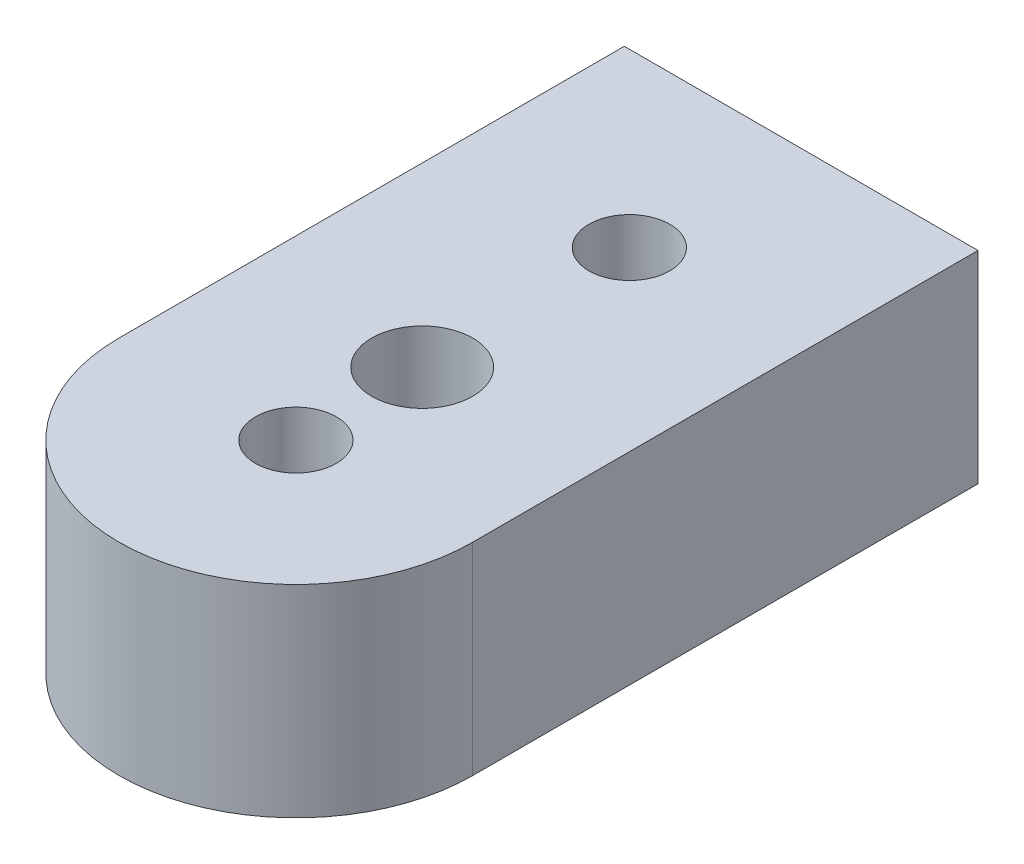
ISO-10303-21;
HEADER;
FILE_DESCRIPTION(('STEP AP214'),'2;1');
FILE_NAME('part.step','',(''),(''),'','','');
FILE_SCHEMA(('AUTOMOTIVE_DESIGN { 1 0 10303 214 1 1 1 1 }'));
ENDSEC;
DATA;
#1=APPLICATION_CONTEXT('core data for automotive mechanical design processes');
#2=APPLICATION_PROTOCOL_DEFINITION('international standard','automotive_design',2000,#1);
#3=PRODUCT_CONTEXT('',#1,'mechanical');
#4=PRODUCT('Part','Part','',(#3));
#5=PRODUCT_RELATED_PRODUCT_CATEGORY('part','',(#4));
#6=PRODUCT_DEFINITION_FORMATION('','',#4);
#7=PRODUCT_DEFINITION_CONTEXT('part definition',#1,'design');
#8=PRODUCT_DEFINITION('design','',#6,#7);
#9=PRODUCT_DEFINITION_SHAPE('','',#8);
#10=(LENGTH_UNIT() NAMED_UNIT(*) SI_UNIT(.MILLI.,.METRE.));
#11=(NAMED_UNIT(*) PLANE_ANGLE_UNIT() SI_UNIT($,.RADIAN.));
#12=(NAMED_UNIT(*) SI_UNIT($,.STERADIAN.) SOLID_ANGLE_UNIT());
#13=UNCERTAINTY_MEASURE_WITH_UNIT(LENGTH_MEASURE(1.E-05),#10,'distance_accuracy_value','');
#14=(GEOMETRIC_REPRESENTATION_CONTEXT(3) GLOBAL_UNCERTAINTY_ASSIGNED_CONTEXT((#13)) GLOBAL_UNIT_ASSIGNED_CONTEXT((#10,
#11,#12)) REPRESENTATION_CONTEXT('',''));
#15=CARTESIAN_POINT('',(0.,0.,0.));
#16=DIRECTION('',(0.,0.,1.));
#17=DIRECTION('',(1.,0.,0.));
#18=AXIS2_PLACEMENT_3D('',#15,#16,#17);
#19=CARTESIAN_POINT('',(0.,8.,5.));
#20=DIRECTION('',(0.,-1.,0.));
#21=DIRECTION('',(0.,0.,-1.));
#22=AXIS2_PLACEMENT_3D('',#19,#20,#21);
#23=PLANE('',#22);
#24=DIRECTION('',(0.,0.,1.));
#25=VECTOR('',#24,1.);
#26=CARTESIAN_POINT('',(-6.99999999999996,8.,5.));
#27=LINE('',#26,#25);
#28=CARTESIAN_POINT('',(-6.99999999999996,8.,-15.));
#29=VERTEX_POINT('',#28);
#30=CARTESIAN_POINT('',(-6.99999999999996,8.,5.));
#31=VERTEX_POINT('',#30);
#32=EDGE_CURVE('E88',#29,#31,#27,.T.);
#33=ORIENTED_EDGE('',*,*,#32,.T.);
#34=CARTESIAN_POINT('',(0.,8.,5.));
#35=DIRECTION('',(0.,1.,0.));
#36=DIRECTION('',(0.,0.,-1.));
#37=AXIS2_PLACEMENT_3D('',#34,#35,#36);
#38=CIRCLE('',#37,7.);
#39=CARTESIAN_POINT('',(7.00000000000004,8.,5.));
#40=VERTEX_POINT('',#39);
#41=EDGE_CURVE('E83',#31,#40,#38,.T.);
#42=ORIENTED_EDGE('',*,*,#41,.T.);
#43=DIRECTION('',(0.,0.,-1.));
#44=VECTOR('',#43,1.);
#45=CARTESIAN_POINT('',(7.00000000000004,8.,-15.));
#46=LINE('',#45,#44);
#47=CARTESIAN_POINT('',(7.00000000000004,8.,-15.));
#48=VERTEX_POINT('',#47);
#49=EDGE_CURVE('E86',#40,#48,#46,.T.);
#50=ORIENTED_EDGE('',*,*,#49,.T.);
#51=DIRECTION('',(-1.,0.,0.));
#52=VECTOR('',#51,1.);
#53=CARTESIAN_POINT('',(-6.99999999999996,8.,-15.));
#54=LINE('',#53,#52);
#55=EDGE_CURVE('E53',#48,#29,#54,.T.);
#56=ORIENTED_EDGE('',*,*,#55,.T.);
#57=EDGE_LOOP('',(#33,#42,#50,#56));
#58=FACE_BOUND('',#57,.T.);
#59=CARTESIAN_POINT('',(0.,8.,0.));
#60=DIRECTION('',(0.,1.,0.));
#61=DIRECTION('',(0.,0.,1.));
#62=AXIS2_PLACEMENT_3D('',#59,#60,#61);
#63=CIRCLE('',#62,2.);
#64=CARTESIAN_POINT('',(0.,8.,2.));
#65=VERTEX_POINT('',#64);
#66=EDGE_CURVE('E103',#65,#65,#63,.T.);
#67=ORIENTED_EDGE('',*,*,#66,.F.);
#68=EDGE_LOOP('',(#67));
#69=FACE_BOUND('',#68,.T.);
#70=CARTESIAN_POINT('',(0.,8.,5.));
#71=DIRECTION('',(0.,1.,0.));
#72=DIRECTION('',(0.,0.,1.));
#73=AXIS2_PLACEMENT_3D('',#70,#71,#72);
#74=CIRCLE('',#73,1.60000000000002);
#75=CARTESIAN_POINT('',(0.,8.,6.60000000000002));
#76=VERTEX_POINT('',#75);
#77=EDGE_CURVE('E118',#76,#76,#74,.T.);
#78=ORIENTED_EDGE('',*,*,#77,.F.);
#79=EDGE_LOOP('',(#78));
#80=FACE_BOUND('',#79,.T.);
#81=CARTESIAN_POINT('',(0.,8.,-8.2));
#82=DIRECTION('',(0.,1.,0.));
#83=DIRECTION('',(0.,0.,1.));
#84=AXIS2_PLACEMENT_3D('',#81,#82,#83);
#85=CIRCLE('',#84,1.6);
#86=CARTESIAN_POINT('',(0.,8.,-6.6));
#87=VERTEX_POINT('',#86);
#88=EDGE_CURVE('E124',#87,#87,#85,.T.);
#89=ORIENTED_EDGE('',*,*,#88,.F.);
#90=EDGE_LOOP('',(#89));
#91=FACE_BOUND('',#90,.T.);
#92=ADVANCED_FACE('F36',(#58,#69,#80,#91),#23,.F.);
#93=CARTESIAN_POINT('',(0.,0.,5.));
#94=DIRECTION('',(0.,-1.,0.));
#95=DIRECTION('',(0.,0.,-1.));
#96=AXIS2_PLACEMENT_3D('',#93,#94,#95);
#97=PLANE('',#96);
#98=CARTESIAN_POINT('',(0.,0.,5.));
#99=DIRECTION('',(0.,1.,0.));
#100=DIRECTION('',(0.,0.,1.));
#101=AXIS2_PLACEMENT_3D('',#98,#99,#100);
#102=CIRCLE('',#101,1.60000000000002);
#103=CARTESIAN_POINT('',(0.,0.,6.60000000000002));
#104=VERTEX_POINT('',#103);
#105=EDGE_CURVE('E121',#104,#104,#102,.T.);
#106=ORIENTED_EDGE('',*,*,#105,.T.);
#107=EDGE_LOOP('',(#106));
#108=FACE_BOUND('',#107,.T.);
#109=DIRECTION('',(0.,0.,1.));
#110=VECTOR('',#109,1.);
#111=CARTESIAN_POINT('',(-6.99999999999996,0.,5.));
#112=LINE('',#111,#110);
#113=CARTESIAN_POINT('',(-6.99999999999996,0.,-15.));
#114=VERTEX_POINT('',#113);
#115=CARTESIAN_POINT('',(-6.99999999999996,0.,5.));
#116=VERTEX_POINT('',#115);
#117=EDGE_CURVE('E100',#114,#116,#112,.T.);
#118=ORIENTED_EDGE('',*,*,#117,.F.);
#119=DIRECTION('',(-1.,0.,0.));
#120=VECTOR('',#119,1.);
#121=CARTESIAN_POINT('',(-6.99999999999996,0.,-15.));
#122=LINE('',#121,#120);
#123=CARTESIAN_POINT('',(7.00000000000004,0.,-15.));
#124=VERTEX_POINT('',#123);
#125=EDGE_CURVE('E76',#124,#114,#122,.T.);
#126=ORIENTED_EDGE('',*,*,#125,.F.);
#127=DIRECTION('',(0.,0.,-1.));
#128=VECTOR('',#127,1.);
#129=CARTESIAN_POINT('',(7.00000000000004,0.,-15.));
#130=LINE('',#129,#128);
#131=CARTESIAN_POINT('',(7.00000000000004,0.,5.));
#132=VERTEX_POINT('',#131);
#133=EDGE_CURVE('E70',#132,#124,#130,.T.);
#134=ORIENTED_EDGE('',*,*,#133,.F.);
#135=CARTESIAN_POINT('',(0.,0.,5.));
#136=DIRECTION('',(0.,1.,0.));
#137=DIRECTION('',(0.,0.,-1.));
#138=AXIS2_PLACEMENT_3D('',#135,#136,#137);
#139=CIRCLE('',#138,7.);
#140=EDGE_CURVE('E92',#116,#132,#139,.T.);
#141=ORIENTED_EDGE('',*,*,#140,.F.);
#142=EDGE_LOOP('',(#118,#126,#134,#141));
#143=FACE_BOUND('',#142,.T.);
#144=CARTESIAN_POINT('',(0.,0.,0.));
#145=DIRECTION('',(0.,1.,0.));
#146=DIRECTION('',(0.,0.,1.));
#147=AXIS2_PLACEMENT_3D('',#144,#145,#146);
#148=CIRCLE('',#147,2.);
#149=CARTESIAN_POINT('',(0.,0.,2.));
#150=VERTEX_POINT('',#149);
#151=EDGE_CURVE('E115',#150,#150,#148,.T.);
#152=ORIENTED_EDGE('',*,*,#151,.T.);
#153=EDGE_LOOP('',(#152));
#154=FACE_BOUND('',#153,.T.);
#155=CARTESIAN_POINT('',(0.,0.,-8.2));
#156=DIRECTION('',(0.,1.,0.));
#157=DIRECTION('',(0.,0.,1.));
#158=AXIS2_PLACEMENT_3D('',#155,#156,#157);
#159=CIRCLE('',#158,1.6);
#160=CARTESIAN_POINT('',(0.,0.,-6.6));
#161=VERTEX_POINT('',#160);
#162=EDGE_CURVE('E127',#161,#161,#159,.T.);
#163=ORIENTED_EDGE('',*,*,#162,.T.);
#164=EDGE_LOOP('',(#163));
#165=FACE_BOUND('',#164,.T.);
#166=ADVANCED_FACE('F111',(#108,#143,#154,#165),#97,.T.);
#167=CARTESIAN_POINT('',(-6.99999999999996,8.,5.));
#168=DIRECTION('',(1.,0.,0.));
#169=DIRECTION('',(0.,0.,-1.));
#170=AXIS2_PLACEMENT_3D('',#167,#168,#169);
#171=PLANE('',#170);
#172=ORIENTED_EDGE('',*,*,#117,.T.);
#173=DIRECTION('',(0.,-1.,0.));
#174=VECTOR('',#173,1.);
#175=CARTESIAN_POINT('',(-6.99999999999996,8.,5.));
#176=LINE('',#175,#174);
#177=EDGE_CURVE('E11',#31,#116,#176,.T.);
#178=ORIENTED_EDGE('',*,*,#177,.F.);
#179=ORIENTED_EDGE('',*,*,#32,.F.);
#180=DIRECTION('',(0.,-1.,0.));
#181=VECTOR('',#180,1.);
#182=CARTESIAN_POINT('',(-6.99999999999996,8.,-15.));
#183=LINE('',#182,#181);
#184=EDGE_CURVE('E96',#29,#114,#183,.T.);
#185=ORIENTED_EDGE('',*,*,#184,.T.);
#186=EDGE_LOOP('',(#172,#178,#179,#185));
#187=FACE_BOUND('',#186,.T.);
#188=ADVANCED_FACE('F38',(#187),#171,.F.);
#189=CARTESIAN_POINT('',(0.,8.,5.));
#190=DIRECTION('',(0.,-1.,0.));
#191=DIRECTION('',(0.,0.,-1.));
#192=AXIS2_PLACEMENT_3D('',#189,#190,#191);
#193=CYLINDRICAL_SURFACE('',#192,7.);
#194=ORIENTED_EDGE('',*,*,#140,.T.);
#195=DIRECTION('',(0.,-1.,0.));
#196=VECTOR('',#195,1.);
#197=CARTESIAN_POINT('',(7.00000000000004,8.,5.));
#198=LINE('',#197,#196);
#199=EDGE_CURVE('E45',#40,#132,#198,.T.);
#200=ORIENTED_EDGE('',*,*,#199,.F.);
#201=ORIENTED_EDGE('',*,*,#41,.F.);
#202=ORIENTED_EDGE('',*,*,#177,.T.);
#203=EDGE_LOOP('',(#194,#200,#201,#202));
#204=FACE_BOUND('',#203,.T.);
#205=ADVANCED_FACE('F91',(#204),#193,.T.);
#206=CARTESIAN_POINT('',(7.00000000000004,8.,-15.));
#207=DIRECTION('',(-1.,0.,0.));
#208=DIRECTION('',(0.,0.,1.));
#209=AXIS2_PLACEMENT_3D('',#206,#207,#208);
#210=PLANE('',#209);
#211=ORIENTED_EDGE('',*,*,#133,.T.);
#212=DIRECTION('',(0.,-1.,0.));
#213=VECTOR('',#212,1.);
#214=CARTESIAN_POINT('',(7.00000000000004,8.,-15.));
#215=LINE('',#214,#213);
#216=EDGE_CURVE('E93',#48,#124,#215,.T.);
#217=ORIENTED_EDGE('',*,*,#216,.F.);
#218=ORIENTED_EDGE('',*,*,#49,.F.);
#219=ORIENTED_EDGE('',*,*,#199,.T.);
#220=EDGE_LOOP('',(#211,#217,#218,#219));
#221=FACE_BOUND('',#220,.T.);
#222=ADVANCED_FACE('F94',(#221),#210,.F.);
#223=CARTESIAN_POINT('',(-6.99999999999996,8.,-15.));
#224=DIRECTION('',(0.,0.,1.));
#225=DIRECTION('',(1.,0.,0.));
#226=AXIS2_PLACEMENT_3D('',#223,#224,#225);
#227=PLANE('',#226);
#228=ORIENTED_EDGE('',*,*,#125,.T.);
#229=ORIENTED_EDGE('',*,*,#184,.F.);
#230=ORIENTED_EDGE('',*,*,#55,.F.);
#231=ORIENTED_EDGE('',*,*,#216,.T.);
#232=EDGE_LOOP('',(#228,#229,#230,#231));
#233=FACE_BOUND('',#232,.T.);
#234=ADVANCED_FACE('F108',(#233),#227,.F.);
#235=CARTESIAN_POINT('',(0.,8.,0.));
#236=DIRECTION('',(0.,-1.,0.));
#237=DIRECTION('',(0.,0.,-1.));
#238=AXIS2_PLACEMENT_3D('',#235,#236,#237);
#239=CYLINDRICAL_SURFACE('',#238,2.);
#240=ORIENTED_EDGE('',*,*,#66,.T.);
#241=EDGE_LOOP('',(#240));
#242=FACE_BOUND('',#241,.T.);
#243=ORIENTED_EDGE('',*,*,#151,.F.);
#244=EDGE_LOOP('',(#243));
#245=FACE_BOUND('',#244,.T.);
#246=ADVANCED_FACE('F144',(#242,#245),#239,.F.);
#247=CARTESIAN_POINT('',(0.,8.,5.));
#248=DIRECTION('',(0.,-1.,0.));
#249=DIRECTION('',(0.,0.,-1.));
#250=AXIS2_PLACEMENT_3D('',#247,#248,#249);
#251=CYLINDRICAL_SURFACE('',#250,1.60000000000002);
#252=ORIENTED_EDGE('',*,*,#77,.T.);
#253=EDGE_LOOP('',(#252));
#254=FACE_BOUND('',#253,.T.);
#255=ORIENTED_EDGE('',*,*,#105,.F.);
#256=EDGE_LOOP('',(#255));
#257=FACE_BOUND('',#256,.T.);
#258=ADVANCED_FACE('F190',(#254,#257),#251,.F.);
#259=CARTESIAN_POINT('',(0.,8.,-8.2));
#260=DIRECTION('',(0.,-1.,0.));
#261=DIRECTION('',(0.,0.,-1.));
#262=AXIS2_PLACEMENT_3D('',#259,#260,#261);
#263=CYLINDRICAL_SURFACE('',#262,1.6);
#264=ORIENTED_EDGE('',*,*,#88,.T.);
#265=EDGE_LOOP('',(#264));
#266=FACE_BOUND('',#265,.T.);
#267=ORIENTED_EDGE('',*,*,#162,.F.);
#268=EDGE_LOOP('',(#267));
#269=FACE_BOUND('',#268,.T.);
#270=ADVANCED_FACE('F133',(#266,#269),#263,.F.);
#271=CLOSED_SHELL('',(#92,#166,#188,#205,#222,#234,#246,#258,#270));
#272=MANIFOLD_SOLID_BREP('B2',#271);
#273=ADVANCED_BREP_SHAPE_REPRESENTATION('',(#18,#272),#14);
#274=SHAPE_DEFINITION_REPRESENTATION(#9,#273);
ENDSEC;
END-ISO-10303-21;
